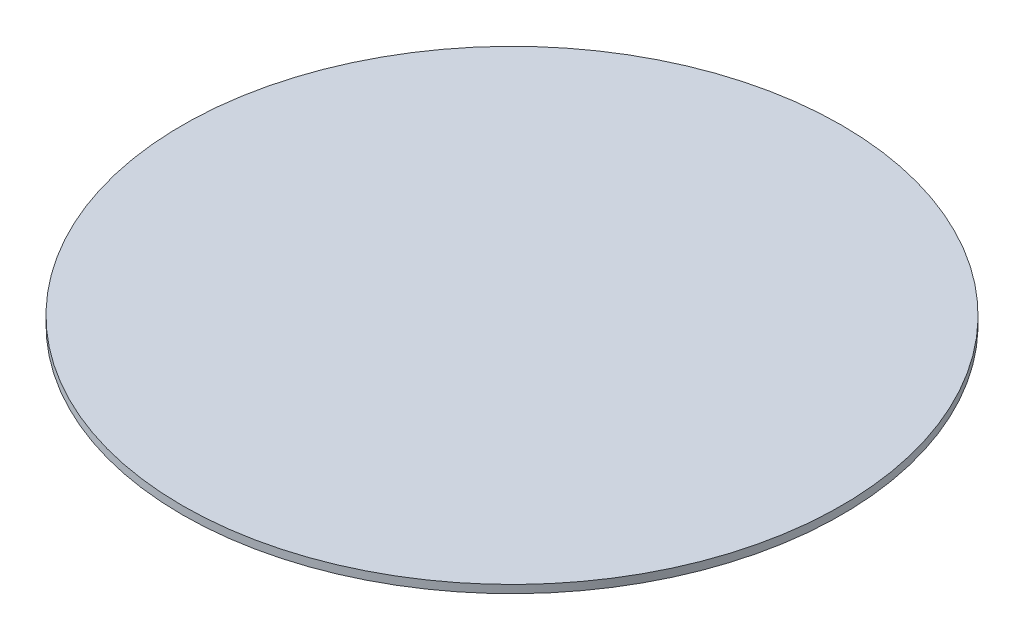
ISO-10303-21;
HEADER;
FILE_DESCRIPTION(('STEP AP214'),'2;1');
FILE_NAME('part.step','',(''),(''),'','','');
FILE_SCHEMA(('AUTOMOTIVE_DESIGN { 1 0 10303 214 1 1 1 1 }'));
ENDSEC;
DATA;
#1=APPLICATION_CONTEXT('core data for automotive mechanical design processes');
#2=APPLICATION_PROTOCOL_DEFINITION('international standard','automotive_design',2000,#1);
#3=PRODUCT_CONTEXT('',#1,'mechanical');
#4=PRODUCT('Part','Part','',(#3));
#5=PRODUCT_RELATED_PRODUCT_CATEGORY('part','',(#4));
#6=PRODUCT_DEFINITION_FORMATION('','',#4);
#7=PRODUCT_DEFINITION_CONTEXT('part definition',#1,'design');
#8=PRODUCT_DEFINITION('design','',#6,#7);
#9=PRODUCT_DEFINITION_SHAPE('','',#8);
#10=(LENGTH_UNIT() NAMED_UNIT(*) SI_UNIT(.MILLI.,.METRE.));
#11=(NAMED_UNIT(*) PLANE_ANGLE_UNIT() SI_UNIT($,.RADIAN.));
#12=(NAMED_UNIT(*) SI_UNIT($,.STERADIAN.) SOLID_ANGLE_UNIT());
#13=UNCERTAINTY_MEASURE_WITH_UNIT(LENGTH_MEASURE(1.E-05),#10,'distance_accuracy_value','');
#14=(GEOMETRIC_REPRESENTATION_CONTEXT(3) GLOBAL_UNCERTAINTY_ASSIGNED_CONTEXT((#13)) GLOBAL_UNIT_ASSIGNED_CONTEXT((#10,
#11,#12)) REPRESENTATION_CONTEXT('',''));
#15=CARTESIAN_POINT('',(0.,0.,0.));
#16=DIRECTION('',(0.,0.,1.));
#17=DIRECTION('',(1.,0.,0.));
#18=AXIS2_PLACEMENT_3D('',#15,#16,#17);
#19=CARTESIAN_POINT('',(0.,1.,0.));
#20=DIRECTION('',(0.,-1.,0.));
#21=DIRECTION('',(0.,0.,-1.));
#22=AXIS2_PLACEMENT_3D('',#19,#20,#21);
#23=CYLINDRICAL_SURFACE('',#22,41.25);
#24=CARTESIAN_POINT('',(0.,1.,0.));
#25=DIRECTION('',(0.,1.,0.));
#26=DIRECTION('',(0.,0.,1.));
#27=AXIS2_PLACEMENT_3D('',#24,#25,#26);
#28=CIRCLE('',#27,41.25);
#29=CARTESIAN_POINT('',(0.,1.,41.25));
#30=VERTEX_POINT('',#29);
#31=EDGE_CURVE('E10',#30,#30,#28,.T.);
#32=ORIENTED_EDGE('',*,*,#31,.F.);
#33=EDGE_LOOP('',(#32));
#34=FACE_BOUND('',#33,.T.);
#35=CARTESIAN_POINT('',(0.,0.,0.));
#36=DIRECTION('',(0.,1.,0.));
#37=DIRECTION('',(0.,0.,1.));
#38=AXIS2_PLACEMENT_3D('',#35,#36,#37);
#39=CIRCLE('',#38,41.25);
#40=CARTESIAN_POINT('',(0.,0.,41.25));
#41=VERTEX_POINT('',#40);
#42=EDGE_CURVE('E34',#41,#41,#39,.T.);
#43=ORIENTED_EDGE('',*,*,#42,.T.);
#44=EDGE_LOOP('',(#43));
#45=FACE_BOUND('',#44,.T.);
#46=ADVANCED_FACE('F31',(#34,#45),#23,.T.);
#47=CARTESIAN_POINT('',(0.,1.,0.));
#48=DIRECTION('',(0.,1.,0.));
#49=DIRECTION('',(0.,0.,1.));
#50=AXIS2_PLACEMENT_3D('',#47,#48,#49);
#51=PLANE('',#50);
#52=ORIENTED_EDGE('',*,*,#31,.T.);
#53=EDGE_LOOP('',(#52));
#54=FACE_BOUND('',#53,.T.);
#55=ADVANCED_FACE('F46',(#54),#51,.T.);
#56=CARTESIAN_POINT('',(0.,0.,0.));
#57=DIRECTION('',(0.,1.,0.));
#58=DIRECTION('',(0.,0.,1.));
#59=AXIS2_PLACEMENT_3D('',#56,#57,#58);
#60=PLANE('',#59);
#61=ORIENTED_EDGE('',*,*,#42,.F.);
#62=EDGE_LOOP('',(#61));
#63=FACE_BOUND('',#62,.T.);
#64=ADVANCED_FACE('F44',(#63),#60,.F.);
#65=CLOSED_SHELL('',(#46,#55,#64));
#66=MANIFOLD_SOLID_BREP('B2',#65);
#67=ADVANCED_BREP_SHAPE_REPRESENTATION('',(#18,#66),#14);
#68=SHAPE_DEFINITION_REPRESENTATION(#9,#67);
ENDSEC;
END-ISO-10303-21;
